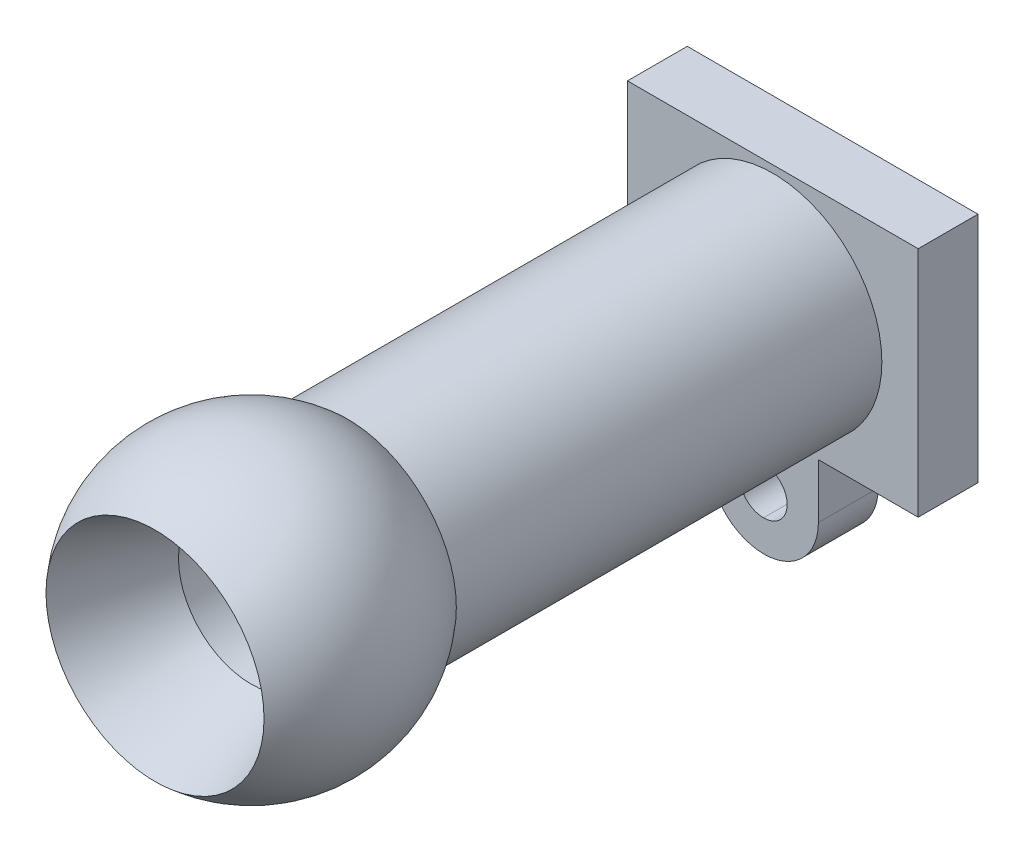
ISO-10303-21;
HEADER;
FILE_DESCRIPTION(('STEP AP214'),'2;1');
FILE_NAME('part.step','',(''),(''),'','','');
FILE_SCHEMA(('AUTOMOTIVE_DESIGN { 1 0 10303 214 1 1 1 1 }'));
ENDSEC;
DATA;
#1=APPLICATION_CONTEXT('core data for automotive mechanical design processes');
#2=APPLICATION_PROTOCOL_DEFINITION('international standard','automotive_design',2000,#1);
#3=PRODUCT_CONTEXT('',#1,'mechanical');
#4=PRODUCT('Part','Part','',(#3));
#5=PRODUCT_RELATED_PRODUCT_CATEGORY('part','',(#4));
#6=PRODUCT_DEFINITION_FORMATION('','',#4);
#7=PRODUCT_DEFINITION_CONTEXT('part definition',#1,'design');
#8=PRODUCT_DEFINITION('design','',#6,#7);
#9=PRODUCT_DEFINITION_SHAPE('','',#8);
#10=(LENGTH_UNIT() NAMED_UNIT(*) SI_UNIT(.MILLI.,.METRE.));
#11=(NAMED_UNIT(*) PLANE_ANGLE_UNIT() SI_UNIT($,.RADIAN.));
#12=(NAMED_UNIT(*) SI_UNIT($,.STERADIAN.) SOLID_ANGLE_UNIT());
#13=UNCERTAINTY_MEASURE_WITH_UNIT(LENGTH_MEASURE(1.E-05),#10,'distance_accuracy_value','');
#14=(GEOMETRIC_REPRESENTATION_CONTEXT(3) GLOBAL_UNCERTAINTY_ASSIGNED_CONTEXT((#13)) GLOBAL_UNIT_ASSIGNED_CONTEXT((#10,
#11,#12)) REPRESENTATION_CONTEXT('',''));
#15=CARTESIAN_POINT('',(0.,0.,0.));
#16=DIRECTION('',(0.,0.,1.));
#17=DIRECTION('',(1.,0.,0.));
#18=AXIS2_PLACEMENT_3D('',#15,#16,#17);
#19=CARTESIAN_POINT('',(10.,-8.,-10.273525536238));
#20=DIRECTION('',(0.,-1.,0.));
#21=DIRECTION('',(0.,0.,-1.));
#22=AXIS2_PLACEMENT_3D('',#19,#20,#21);
#23=PLANE('',#22);
#24=DIRECTION('',(-1.,0.,0.));
#25=VECTOR('',#24,1.);
#26=CARTESIAN_POINT('',(10.,-8.,-35.8860224859693));
#27=LINE('',#26,#25);
#28=CARTESIAN_POINT('',(10.,-8.,-35.8860224859693));
#29=VERTEX_POINT('',#28);
#30=CARTESIAN_POINT('',(3.13387488333208,-8.00000000000002,-35.8860224859693));
#31=VERTEX_POINT('',#30);
#32=EDGE_CURVE('E194',#29,#31,#27,.T.);
#33=ORIENTED_EDGE('',*,*,#32,.T.);
#34=DIRECTION('',(0.,0.,-1.));
#35=VECTOR('',#34,1.);
#36=CARTESIAN_POINT('',(3.13387488333208,-8.00000000000002,-25.2794207681711));
#37=LINE('',#36,#35);
#38=CARTESIAN_POINT('',(3.13387488333208,-8.,-40.));
#39=VERTEX_POINT('',#38);
#40=EDGE_CURVE('E166',#31,#39,#37,.T.);
#41=ORIENTED_EDGE('',*,*,#40,.T.);
#42=DIRECTION('',(-1.,0.,0.));
#43=VECTOR('',#42,1.);
#44=CARTESIAN_POINT('',(10.,-8.,-40.));
#45=LINE('',#44,#43);
#46=CARTESIAN_POINT('',(10.,-8.,-40.));
#47=VERTEX_POINT('',#46);
#48=EDGE_CURVE('E173',#47,#39,#45,.T.);
#49=ORIENTED_EDGE('',*,*,#48,.F.);
#50=DIRECTION('',(0.,0.,-1.));
#51=VECTOR('',#50,1.);
#52=CARTESIAN_POINT('',(10.,-8.,-10.273525536238));
#53=LINE('',#52,#51);
#54=EDGE_CURVE('E201',#29,#47,#53,.T.);
#55=ORIENTED_EDGE('',*,*,#54,.F.);
#56=EDGE_LOOP('',(#33,#41,#49,#55));
#57=FACE_BOUND('',#56,.T.);
#58=ADVANCED_FACE('F44',(#57),#23,.T.);
#59=CARTESIAN_POINT('',(0.,0.,-40.));
#60=DIRECTION('',(0.,0.,1.));
#61=DIRECTION('',(1.,0.,0.));
#62=AXIS2_PLACEMENT_3D('',#59,#60,#61);
#63=CYLINDRICAL_SURFACE('',#62,7.5);
#64=CARTESIAN_POINT('',(0.,0.,-35.8860224859693));
#65=DIRECTION('',(0.,0.,1.));
#66=DIRECTION('',(0.,-1.,0.));
#67=AXIS2_PLACEMENT_3D('',#64,#65,#66);
#68=CIRCLE('',#67,7.5);
#69=CARTESIAN_POINT('',(0.,-7.5,-35.8860224859693));
#70=VERTEX_POINT('',#69);
#71=EDGE_CURVE('E138',#70,#70,#68,.F.);
#72=ORIENTED_EDGE('',*,*,#71,.F.);
#73=EDGE_LOOP('',(#72));
#74=FACE_BOUND('',#73,.T.);
#75=CARTESIAN_POINT('',(0.,0.,-6.61437827766148));
#76=DIRECTION('',(0.,0.,1.));
#77=DIRECTION('',(1.,0.,0.));
#78=AXIS2_PLACEMENT_3D('',#75,#76,#77);
#79=CIRCLE('',#78,7.5);
#80=CARTESIAN_POINT('',(7.5,0.,-6.61437827766148));
#81=VERTEX_POINT('',#80);
#82=EDGE_CURVE('E207',#81,#81,#79,.T.);
#83=ORIENTED_EDGE('',*,*,#82,.F.);
#84=EDGE_LOOP('',(#83));
#85=FACE_BOUND('',#84,.T.);
#86=ADVANCED_FACE('F240',(#74,#85),#63,.T.);
#87=CARTESIAN_POINT('',(0.,0.,0.));
#88=DIRECTION('',(0.,1.,0.));
#89=DIRECTION('',(1.,0.,0.));
#90=AXIS2_PLACEMENT_3D('',#87,#88,#89);
#91=SPHERICAL_SURFACE('',#90,10.);
#92=CARTESIAN_POINT('',(0.,0.,0.));
#93=DIRECTION('',(0.,0.,-1.));
#94=DIRECTION('',(-1.,0.,0.));
#95=AXIS2_PLACEMENT_3D('',#92,#93,#94);
#96=SPHERICAL_SURFACE('',#95,10.);
#97=CARTESIAN_POINT('',(0.,0.,6.61488208863153));
#98=DIRECTION('',(0.,0.,-1.));
#99=DIRECTION('',(-1.,0.,0.));
#100=AXIS2_PLACEMENT_3D('',#97,#98,#99);
#101=CIRCLE('',#100,7.49955565040368);
#102=CARTESIAN_POINT('',(-7.49955565040368,0.,6.61488208863153));
#103=VERTEX_POINT('',#102);
#104=EDGE_CURVE('E153',#103,#103,#101,.T.);
#105=ORIENTED_EDGE('',*,*,#104,.T.);
#106=EDGE_LOOP('',(#105));
#107=FACE_BOUND('',#106,.T.);
#108=ORIENTED_EDGE('',*,*,#82,.T.);
#109=EDGE_LOOP('',(#108));
#110=FACE_BOUND('',#109,.T.);
#111=ADVANCED_FACE('F247',(#107,#110),#96,.T.);
#112=CARTESIAN_POINT('',(-29.295979999424,-5.00000000000009,-35.8860224859693));
#113=DIRECTION('',(0.,0.,1.));
#114=DIRECTION('',(1.,0.,0.));
#115=AXIS2_PLACEMENT_3D('',#112,#113,#114);
#116=PLANE('',#115);
#117=CARTESIAN_POINT('',(-0.61612511666792,-11.75,-35.8860224859693));
#118=DIRECTION('',(0.,0.,1.));
#119=DIRECTION('',(0.,-1.,0.));
#120=AXIS2_PLACEMENT_3D('',#117,#118,#119);
#121=CIRCLE('',#120,1.6);
#122=CARTESIAN_POINT('',(-0.639115116379957,-13.3498348226968,-35.8860224859693));
#123=VERTEX_POINT('',#122);
#124=CARTESIAN_POINT('',(-0.639115116379957,-10.1501651773032,-35.8860224859693));
#125=VERTEX_POINT('',#124);
#126=EDGE_CURVE('E132',#123,#125,#121,.T.);
#127=ORIENTED_EDGE('',*,*,#126,.F.);
#128=CARTESIAN_POINT('',(-0.662105116091993,-11.75,-35.8860224859693));
#129=DIRECTION('',(0.,0.,1.));
#130=DIRECTION('',(0.,-1.,0.));
#131=AXIS2_PLACEMENT_3D('',#128,#129,#130);
#132=CIRCLE('',#131,1.6);
#133=EDGE_CURVE('E147',#125,#123,#132,.T.);
#134=ORIENTED_EDGE('',*,*,#133,.F.);
#135=EDGE_LOOP('',(#127,#134));
#136=FACE_BOUND('',#135,.T.);
#137=ORIENTED_EDGE('',*,*,#71,.T.);
#138=EDGE_LOOP('',(#137));
#139=FACE_BOUND('',#138,.T.);
#140=CARTESIAN_POINT('',(-0.61612511666792,-11.75,-35.8860224859693));
#141=DIRECTION('',(0.,0.,1.));
#142=DIRECTION('',(0.,-1.,0.));
#143=AXIS2_PLACEMENT_3D('',#140,#141,#142);
#144=CIRCLE('',#143,3.75);
#145=CARTESIAN_POINT('',(-4.36612511666792,-11.75,-35.8860224859693));
#146=VERTEX_POINT('',#145);
#147=CARTESIAN_POINT('',(-0.61612511666792,-15.5,-35.8860224859693));
#148=VERTEX_POINT('',#147);
#149=EDGE_CURVE('E60',#146,#148,#144,.T.);
#150=ORIENTED_EDGE('',*,*,#149,.T.);
#151=CARTESIAN_POINT('',(-0.61612511666792,-11.75,-35.8860224859693));
#152=DIRECTION('',(0.,0.,1.));
#153=DIRECTION('',(0.,-1.,0.));
#154=AXIS2_PLACEMENT_3D('',#151,#152,#153);
#155=CIRCLE('',#154,3.75);
#156=CARTESIAN_POINT('',(3.13387488333208,-11.75,-35.8860224859693));
#157=VERTEX_POINT('',#156);
#158=EDGE_CURVE('E53',#148,#157,#155,.T.);
#159=ORIENTED_EDGE('',*,*,#158,.T.);
#160=DIRECTION('',(0.,-1.,0.));
#161=VECTOR('',#160,1.);
#162=CARTESIAN_POINT('',(3.13387488333208,-8.00000000000003,-35.8860224859693));
#163=LINE('',#162,#161);
#164=EDGE_CURVE('E162',#31,#157,#163,.T.);
#165=ORIENTED_EDGE('',*,*,#164,.F.);
#166=ORIENTED_EDGE('',*,*,#32,.F.);
#167=DIRECTION('',(0.,-1.,0.));
#168=VECTOR('',#167,1.);
#169=CARTESIAN_POINT('',(10.,-8.00000000000002,-35.8860224859693));
#170=LINE('',#169,#168);
#171=CARTESIAN_POINT('',(10.,8.,-35.8860224859694));
#172=VERTEX_POINT('',#171);
#173=EDGE_CURVE('E198',#172,#29,#170,.T.);
#174=ORIENTED_EDGE('',*,*,#173,.F.);
#175=DIRECTION('',(1.,0.,0.));
#176=VECTOR('',#175,1.);
#177=CARTESIAN_POINT('',(10.,8.,-35.8860224859694));
#178=LINE('',#177,#176);
#179=CARTESIAN_POINT('',(-10.,8.,-35.8860224859694));
#180=VERTEX_POINT('',#179);
#181=EDGE_CURVE('E176',#180,#172,#178,.T.);
#182=ORIENTED_EDGE('',*,*,#181,.F.);
#183=DIRECTION('',(0.,1.,0.));
#184=VECTOR('',#183,1.);
#185=CARTESIAN_POINT('',(-10.,-8.00000000000002,-35.8860224859693));
#186=LINE('',#185,#184);
#187=CARTESIAN_POINT('',(-10.,-8.,-35.8860224859693));
#188=VERTEX_POINT('',#187);
#189=EDGE_CURVE('E189',#188,#180,#186,.T.);
#190=ORIENTED_EDGE('',*,*,#189,.F.);
#191=CARTESIAN_POINT('',(-4.36612511666792,-8.00000000000002,-35.8860224859693));
#192=VERTEX_POINT('',#191);
#193=EDGE_CURVE('E197',#192,#188,#27,.T.);
#194=ORIENTED_EDGE('',*,*,#193,.F.);
#195=DIRECTION('',(0.,1.,0.));
#196=VECTOR('',#195,1.);
#197=CARTESIAN_POINT('',(-4.36612511666792,-8.00000000000003,-35.8860224859693));
#198=LINE('',#197,#196);
#199=EDGE_CURVE('E159',#146,#192,#198,.T.);
#200=ORIENTED_EDGE('',*,*,#199,.F.);
#201=EDGE_LOOP('',(#150,#159,#165,#166,#174,#182,#190,#194,#200));
#202=FACE_BOUND('',#201,.T.);
#203=ADVANCED_FACE('F222',(#136,#139,#202),#116,.T.);
#204=CARTESIAN_POINT('',(10.,8.,-10.273525536238));
#205=DIRECTION('',(0.,1.,0.));
#206=DIRECTION('',(0.,0.,1.));
#207=AXIS2_PLACEMENT_3D('',#204,#205,#206);
#208=PLANE('',#207);
#209=DIRECTION('',(0.,0.,-1.));
#210=VECTOR('',#209,1.);
#211=CARTESIAN_POINT('',(-10.,8.,-10.273525536238));
#212=LINE('',#211,#210);
#213=CARTESIAN_POINT('',(-10.,8.,-40.));
#214=VERTEX_POINT('',#213);
#215=EDGE_CURVE('E192',#180,#214,#212,.T.);
#216=ORIENTED_EDGE('',*,*,#215,.F.);
#217=ORIENTED_EDGE('',*,*,#181,.T.);
#218=DIRECTION('',(0.,0.,-1.));
#219=VECTOR('',#218,1.);
#220=CARTESIAN_POINT('',(10.,8.,-10.273525536238));
#221=LINE('',#220,#219);
#222=CARTESIAN_POINT('',(10.,8.,-40.));
#223=VERTEX_POINT('',#222);
#224=EDGE_CURVE('E188',#172,#223,#221,.T.);
#225=ORIENTED_EDGE('',*,*,#224,.T.);
#226=DIRECTION('',(1.,0.,0.));
#227=VECTOR('',#226,1.);
#228=CARTESIAN_POINT('',(10.,8.,-40.));
#229=LINE('',#228,#227);
#230=EDGE_CURVE('E181',#214,#223,#229,.T.);
#231=ORIENTED_EDGE('',*,*,#230,.F.);
#232=EDGE_LOOP('',(#216,#217,#225,#231));
#233=FACE_BOUND('',#232,.T.);
#234=ADVANCED_FACE('F261',(#233),#208,.T.);
#235=CARTESIAN_POINT('',(10.,-8.,-10.273525536238));
#236=DIRECTION('',(1.,0.,0.));
#237=DIRECTION('',(0.,0.,-1.));
#238=AXIS2_PLACEMENT_3D('',#235,#236,#237);
#239=PLANE('',#238);
#240=ORIENTED_EDGE('',*,*,#224,.F.);
#241=ORIENTED_EDGE('',*,*,#173,.T.);
#242=ORIENTED_EDGE('',*,*,#54,.T.);
#243=DIRECTION('',(0.,-1.,0.));
#244=VECTOR('',#243,1.);
#245=CARTESIAN_POINT('',(10.,-8.,-40.));
#246=LINE('',#245,#244);
#247=EDGE_CURVE('E178',#223,#47,#246,.T.);
#248=ORIENTED_EDGE('',*,*,#247,.F.);
#249=EDGE_LOOP('',(#240,#241,#242,#248));
#250=FACE_BOUND('',#249,.T.);
#251=ADVANCED_FACE('F254',(#250),#239,.T.);
#252=DIRECTION('',(0.,0.,-1.));
#253=VECTOR('',#252,1.);
#254=CARTESIAN_POINT('',(-4.36612511666792,-8.00000000000002,-25.2794207681711));
#255=LINE('',#254,#253);
#256=CARTESIAN_POINT('',(-4.36612511666792,-8.00000000000002,-40.));
#257=VERTEX_POINT('',#256);
#258=EDGE_CURVE('E168',#192,#257,#255,.T.);
#259=ORIENTED_EDGE('',*,*,#258,.F.);
#260=ORIENTED_EDGE('',*,*,#193,.T.);
#261=DIRECTION('',(0.,0.,-1.));
#262=VECTOR('',#261,1.);
#263=CARTESIAN_POINT('',(-10.,-8.,-10.273525536238));
#264=LINE('',#263,#262);
#265=CARTESIAN_POINT('',(-10.,-8.,-40.));
#266=VERTEX_POINT('',#265);
#267=EDGE_CURVE('E193',#188,#266,#264,.T.);
#268=ORIENTED_EDGE('',*,*,#267,.T.);
#269=EDGE_CURVE('E177',#257,#266,#45,.T.);
#270=ORIENTED_EDGE('',*,*,#269,.F.);
#271=EDGE_LOOP('',(#259,#260,#268,#270));
#272=FACE_BOUND('',#271,.T.);
#273=ADVANCED_FACE('F243',(#272),#23,.T.);
#274=CARTESIAN_POINT('',(-10.,-8.,-10.273525536238));
#275=DIRECTION('',(-1.,0.,0.));
#276=DIRECTION('',(0.,0.,1.));
#277=AXIS2_PLACEMENT_3D('',#274,#275,#276);
#278=PLANE('',#277);
#279=ORIENTED_EDGE('',*,*,#267,.F.);
#280=ORIENTED_EDGE('',*,*,#189,.T.);
#281=ORIENTED_EDGE('',*,*,#215,.T.);
#282=DIRECTION('',(0.,1.,0.));
#283=VECTOR('',#282,1.);
#284=CARTESIAN_POINT('',(-10.,-8.,-40.));
#285=LINE('',#284,#283);
#286=EDGE_CURVE('E165',#266,#214,#285,.T.);
#287=ORIENTED_EDGE('',*,*,#286,.F.);
#288=EDGE_LOOP('',(#279,#280,#281,#287));
#289=FACE_BOUND('',#288,.T.);
#290=ADVANCED_FACE('F253',(#289),#278,.T.);
#291=CARTESIAN_POINT('',(0.,0.,-40.));
#292=DIRECTION('',(0.,0.,1.));
#293=DIRECTION('',(1.,0.,0.));
#294=AXIS2_PLACEMENT_3D('',#291,#292,#293);
#295=PLANE('',#294);
#296=CARTESIAN_POINT('',(0.,0.,-40.));
#297=DIRECTION('',(0.,0.,1.));
#298=DIRECTION('',(1.,0.,0.));
#299=AXIS2_PLACEMENT_3D('',#296,#297,#298);
#300=CIRCLE('',#299,5.);
#301=CARTESIAN_POINT('',(5.,0.,-40.));
#302=VERTEX_POINT('',#301);
#303=EDGE_CURVE('E148',#302,#302,#300,.T.);
#304=ORIENTED_EDGE('',*,*,#303,.T.);
#305=EDGE_LOOP('',(#304));
#306=FACE_BOUND('',#305,.T.);
#307=CARTESIAN_POINT('',(-0.662105116091993,-11.75,-40.));
#308=DIRECTION('',(0.,0.,1.));
#309=DIRECTION('',(1.,0.,0.));
#310=AXIS2_PLACEMENT_3D('',#307,#308,#309);
#311=CIRCLE('',#310,1.6);
#312=CARTESIAN_POINT('',(-0.639115116379957,-10.1501651773032,-40.));
#313=VERTEX_POINT('',#312);
#314=CARTESIAN_POINT('',(-0.639115116379957,-13.3498348226968,-40.));
#315=VERTEX_POINT('',#314);
#316=EDGE_CURVE('E144',#313,#315,#311,.T.);
#317=ORIENTED_EDGE('',*,*,#316,.T.);
#318=CARTESIAN_POINT('',(-0.61612511666792,-11.75,-40.));
#319=DIRECTION('',(0.,0.,-1.));
#320=DIRECTION('',(-1.,0.,0.));
#321=AXIS2_PLACEMENT_3D('',#318,#319,#320);
#322=CIRCLE('',#321,1.6);
#323=EDGE_CURVE('E129',#313,#315,#322,.T.);
#324=ORIENTED_EDGE('',*,*,#323,.F.);
#325=EDGE_LOOP('',(#317,#324));
#326=FACE_BOUND('',#325,.T.);
#327=DIRECTION('',(0.,-1.,0.));
#328=VECTOR('',#327,1.);
#329=CARTESIAN_POINT('',(3.13387488333208,-8.00000000000002,-40.));
#330=LINE('',#329,#328);
#331=CARTESIAN_POINT('',(3.13387488333208,-11.75,-40.));
#332=VERTEX_POINT('',#331);
#333=EDGE_CURVE('E150',#39,#332,#330,.T.);
#334=ORIENTED_EDGE('',*,*,#333,.T.);
#335=CARTESIAN_POINT('',(-0.61612511666792,-11.75,-40.));
#336=DIRECTION('',(0.,0.,1.));
#337=DIRECTION('',(1.,0.,0.));
#338=AXIS2_PLACEMENT_3D('',#335,#336,#337);
#339=CIRCLE('',#338,3.75);
#340=CARTESIAN_POINT('',(-0.61612511666792,-15.5,-40.));
#341=VERTEX_POINT('',#340);
#342=EDGE_CURVE('E218',#332,#341,#339,.F.);
#343=ORIENTED_EDGE('',*,*,#342,.T.);
#344=CARTESIAN_POINT('',(-0.61612511666792,-11.75,-40.));
#345=DIRECTION('',(0.,0.,1.));
#346=DIRECTION('',(1.,0.,0.));
#347=AXIS2_PLACEMENT_3D('',#344,#345,#346);
#348=CIRCLE('',#347,3.75);
#349=CARTESIAN_POINT('',(-4.36612511666792,-11.75,-40.));
#350=VERTEX_POINT('',#349);
#351=EDGE_CURVE('E216',#341,#350,#348,.F.);
#352=ORIENTED_EDGE('',*,*,#351,.T.);
#353=DIRECTION('',(0.,1.,0.));
#354=VECTOR('',#353,1.);
#355=CARTESIAN_POINT('',(-4.36612511666792,-8.00000000000002,-40.));
#356=LINE('',#355,#354);
#357=EDGE_CURVE('E157',#350,#257,#356,.T.);
#358=ORIENTED_EDGE('',*,*,#357,.T.);
#359=ORIENTED_EDGE('',*,*,#269,.T.);
#360=ORIENTED_EDGE('',*,*,#286,.T.);
#361=ORIENTED_EDGE('',*,*,#230,.T.);
#362=ORIENTED_EDGE('',*,*,#247,.T.);
#363=ORIENTED_EDGE('',*,*,#48,.T.);
#364=EDGE_LOOP('',(#334,#343,#352,#358,#359,#360,#361,#362,#363));
#365=FACE_BOUND('',#364,.T.);
#366=ADVANCED_FACE('F142',(#306,#326,#365),#295,.F.);
#367=CARTESIAN_POINT('',(-4.36612511666792,-8.00000000000002,-25.2794207681711));
#368=DIRECTION('',(-1.,0.,0.));
#369=DIRECTION('',(0.,0.,1.));
#370=AXIS2_PLACEMENT_3D('',#367,#368,#369);
#371=PLANE('',#370);
#372=ORIENTED_EDGE('',*,*,#357,.F.);
#373=DIRECTION('',(0.,0.,-1.));
#374=VECTOR('',#373,1.);
#375=CARTESIAN_POINT('',(-4.36612511666792,-11.75,-25.2794207681711));
#376=LINE('',#375,#374);
#377=EDGE_CURVE('E13',#350,#146,#376,.F.);
#378=ORIENTED_EDGE('',*,*,#377,.T.);
#379=ORIENTED_EDGE('',*,*,#199,.T.);
#380=ORIENTED_EDGE('',*,*,#258,.T.);
#381=EDGE_LOOP('',(#372,#378,#379,#380));
#382=FACE_BOUND('',#381,.T.);
#383=ADVANCED_FACE('F271',(#382),#371,.T.);
#384=CARTESIAN_POINT('',(3.13387488333208,-8.00000000000002,-25.2794207681711));
#385=DIRECTION('',(1.,0.,0.));
#386=DIRECTION('',(0.,0.,-1.));
#387=AXIS2_PLACEMENT_3D('',#384,#385,#386);
#388=PLANE('',#387);
#389=ORIENTED_EDGE('',*,*,#164,.T.);
#390=DIRECTION('',(0.,0.,-1.));
#391=VECTOR('',#390,1.);
#392=CARTESIAN_POINT('',(3.13387488333208,-11.75,-25.2794207681711));
#393=LINE('',#392,#391);
#394=EDGE_CURVE('E213',#157,#332,#393,.T.);
#395=ORIENTED_EDGE('',*,*,#394,.T.);
#396=ORIENTED_EDGE('',*,*,#333,.F.);
#397=ORIENTED_EDGE('',*,*,#40,.F.);
#398=EDGE_LOOP('',(#389,#395,#396,#397));
#399=FACE_BOUND('',#398,.T.);
#400=ADVANCED_FACE('F228',(#399),#388,.T.);
#401=CARTESIAN_POINT('',(-0.662105116091993,-11.75,-31.3605390863754));
#402=DIRECTION('',(0.,0.,-1.));
#403=DIRECTION('',(-1.,0.,0.));
#404=AXIS2_PLACEMENT_3D('',#401,#402,#403);
#405=CYLINDRICAL_SURFACE('',#404,1.6);
#406=DIRECTION('',(0.,0.,-1.));
#407=VECTOR('',#406,1.);
#408=CARTESIAN_POINT('',(-0.639115116379957,-13.3498348226968,-16.6925589556842));
#409=LINE('',#408,#407);
#410=EDGE_CURVE('E137',#315,#123,#409,.F.);
#411=ORIENTED_EDGE('',*,*,#410,.F.);
#412=ORIENTED_EDGE('',*,*,#316,.F.);
#413=DIRECTION('',(0.,0.,-1.));
#414=VECTOR('',#413,1.);
#415=CARTESIAN_POINT('',(-0.639115116379957,-10.1501651773032,-16.6925589556842));
#416=LINE('',#415,#414);
#417=EDGE_CURVE('E126',#125,#313,#416,.T.);
#418=ORIENTED_EDGE('',*,*,#417,.F.);
#419=ORIENTED_EDGE('',*,*,#133,.T.);
#420=EDGE_LOOP('',(#411,#412,#418,#419));
#421=FACE_BOUND('',#420,.T.);
#422=ADVANCED_FACE('F146',(#421),#405,.F.);
#423=CARTESIAN_POINT('',(0.,0.,-40.));
#424=DIRECTION('',(0.,0.,1.));
#425=DIRECTION('',(1.,0.,0.));
#426=AXIS2_PLACEMENT_3D('',#423,#424,#425);
#427=CYLINDRICAL_SURFACE('',#426,5.);
#428=CARTESIAN_POINT('',(0.,0.,0.));
#429=DIRECTION('',(0.,0.,-1.));
#430=DIRECTION('',(-1.,0.,0.));
#431=AXIS2_PLACEMENT_3D('',#428,#429,#430);
#432=CIRCLE('',#431,5.);
#433=CARTESIAN_POINT('',(-5.,0.,0.));
#434=VERTEX_POINT('',#433);
#435=EDGE_CURVE('E295',#434,#434,#432,.T.);
#436=ORIENTED_EDGE('',*,*,#435,.F.);
#437=EDGE_LOOP('',(#436));
#438=FACE_BOUND('',#437,.T.);
#439=ORIENTED_EDGE('',*,*,#303,.F.);
#440=EDGE_LOOP('',(#439));
#441=FACE_BOUND('',#440,.T.);
#442=ADVANCED_FACE('F284',(#438,#441),#427,.F.);
#443=CARTESIAN_POINT('',(0.,0.,0.));
#444=DIRECTION('',(0.,0.,1.));
#445=DIRECTION('',(1.,0.,0.));
#446=AXIS2_PLACEMENT_3D('',#443,#444,#445);
#447=CONICAL_SURFACE('',#446,5.,0.36128315516282);
#448=ORIENTED_EDGE('',*,*,#435,.T.);
#449=EDGE_LOOP('',(#448));
#450=FACE_BOUND('',#449,.T.);
#451=ORIENTED_EDGE('',*,*,#104,.F.);
#452=EDGE_LOOP('',(#451));
#453=FACE_BOUND('',#452,.T.);
#454=ADVANCED_FACE('F237',(#450,#453),#447,.F.);
#455=CARTESIAN_POINT('',(-0.61612511666792,-11.75,6.61488208863153));
#456=DIRECTION('',(0.,0.,-1.));
#457=DIRECTION('',(-1.,0.,0.));
#458=AXIS2_PLACEMENT_3D('',#455,#456,#457);
#459=CYLINDRICAL_SURFACE('',#458,1.6);
#460=ORIENTED_EDGE('',*,*,#410,.T.);
#461=ORIENTED_EDGE('',*,*,#126,.T.);
#462=ORIENTED_EDGE('',*,*,#417,.T.);
#463=ORIENTED_EDGE('',*,*,#323,.T.);
#464=EDGE_LOOP('',(#460,#461,#462,#463));
#465=FACE_BOUND('',#464,.T.);
#466=ADVANCED_FACE('F128',(#465),#459,.F.);
#467=CARTESIAN_POINT('',(-0.61612511666792,-11.75,-25.2794207681711));
#468=DIRECTION('',(0.,0.,-1.));
#469=DIRECTION('',(-1.,0.,0.));
#470=AXIS2_PLACEMENT_3D('',#467,#468,#469);
#471=CYLINDRICAL_SURFACE('',#470,3.75);
#472=DIRECTION('',(0.,0.,-1.));
#473=VECTOR('',#472,1.);
#474=CARTESIAN_POINT('',(-0.61612511666792,-15.5,-25.2794207681711));
#475=LINE('',#474,#473);
#476=EDGE_CURVE('E48',#148,#341,#475,.T.);
#477=ORIENTED_EDGE('',*,*,#476,.F.);
#478=ORIENTED_EDGE('',*,*,#149,.F.);
#479=ORIENTED_EDGE('',*,*,#377,.F.);
#480=ORIENTED_EDGE('',*,*,#351,.F.);
#481=EDGE_LOOP('',(#477,#478,#479,#480));
#482=FACE_BOUND('',#481,.T.);
#483=ADVANCED_FACE('F46',(#482),#471,.T.);
#484=CARTESIAN_POINT('',(-0.61612511666792,-11.75,-25.2794207681711));
#485=DIRECTION('',(0.,0.,-1.));
#486=DIRECTION('',(-1.,0.,0.));
#487=AXIS2_PLACEMENT_3D('',#484,#485,#486);
#488=CYLINDRICAL_SURFACE('',#487,3.75);
#489=ORIENTED_EDGE('',*,*,#158,.F.);
#490=ORIENTED_EDGE('',*,*,#476,.T.);
#491=ORIENTED_EDGE('',*,*,#342,.F.);
#492=ORIENTED_EDGE('',*,*,#394,.F.);
#493=EDGE_LOOP('',(#489,#490,#491,#492));
#494=FACE_BOUND('',#493,.T.);
#495=ADVANCED_FACE('F229',(#494),#488,.T.);
#496=CLOSED_SHELL('',(#58,#86,#111,#203,#234,#251,#273,#290,#366,#383,#400,#422,#442,#454,#466,
#483,#495));
#497=MANIFOLD_SOLID_BREP('B2',#496);
#498=ADVANCED_BREP_SHAPE_REPRESENTATION('',(#18,#497),#14);
#499=SHAPE_DEFINITION_REPRESENTATION(#9,#498);
ENDSEC;
END-ISO-10303-21;
